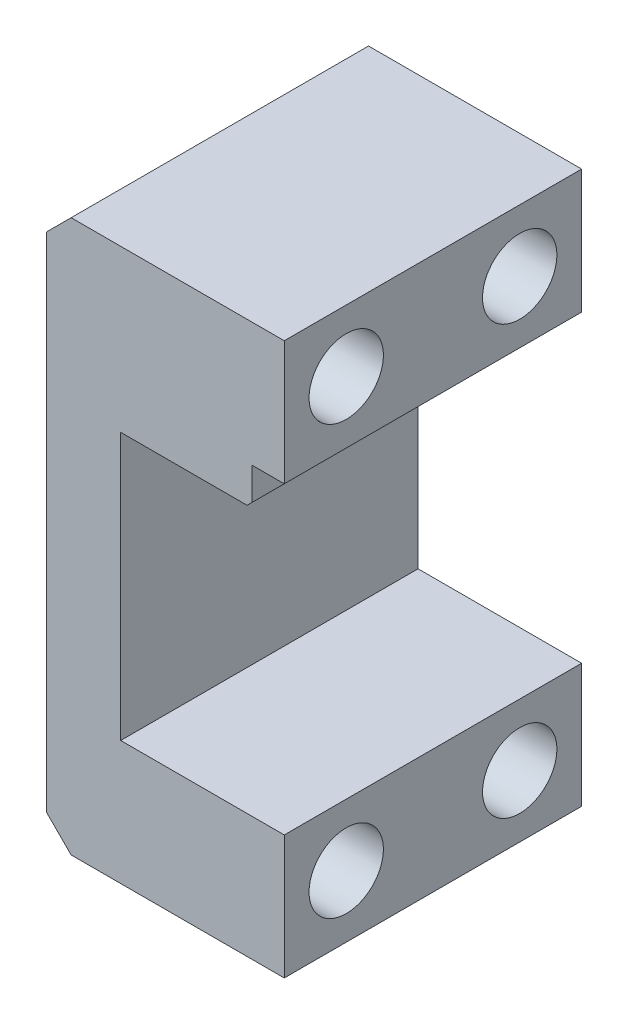
ISO-10303-21;
HEADER;
FILE_DESCRIPTION(('STEP AP214'),'2;1');
FILE_NAME('part.step','',(''),(''),'','','');
FILE_SCHEMA(('AUTOMOTIVE_DESIGN { 1 0 10303 214 1 1 1 1 }'));
ENDSEC;
DATA;
#1=APPLICATION_CONTEXT('core data for automotive mechanical design processes');
#2=APPLICATION_PROTOCOL_DEFINITION('international standard','automotive_design',2000,#1);
#3=PRODUCT_CONTEXT('',#1,'mechanical');
#4=PRODUCT('Part','Part','',(#3));
#5=PRODUCT_RELATED_PRODUCT_CATEGORY('part','',(#4));
#6=PRODUCT_DEFINITION_FORMATION('','',#4);
#7=PRODUCT_DEFINITION_CONTEXT('part definition',#1,'design');
#8=PRODUCT_DEFINITION('design','',#6,#7);
#9=PRODUCT_DEFINITION_SHAPE('','',#8);
#10=(LENGTH_UNIT() NAMED_UNIT(*) SI_UNIT(.MILLI.,.METRE.));
#11=(NAMED_UNIT(*) PLANE_ANGLE_UNIT() SI_UNIT($,.RADIAN.));
#12=(NAMED_UNIT(*) SI_UNIT($,.STERADIAN.) SOLID_ANGLE_UNIT());
#13=UNCERTAINTY_MEASURE_WITH_UNIT(LENGTH_MEASURE(1.E-05),#10,'distance_accuracy_value','');
#14=(GEOMETRIC_REPRESENTATION_CONTEXT(3) GLOBAL_UNCERTAINTY_ASSIGNED_CONTEXT((#13)) GLOBAL_UNIT_ASSIGNED_CONTEXT((#10,
#11,#12)) REPRESENTATION_CONTEXT('',''));
#15=CARTESIAN_POINT('',(0.,0.,0.));
#16=DIRECTION('',(0.,0.,1.));
#17=DIRECTION('',(1.,0.,0.));
#18=AXIS2_PLACEMENT_3D('',#15,#16,#17);
#19=CARTESIAN_POINT('',(9.6,0.,12.));
#20=DIRECTION('',(0.,1.,0.));
#21=DIRECTION('',(-1.,0.,0.));
#22=AXIS2_PLACEMENT_3D('',#19,#20,#21);
#23=PLANE('',#22);
#24=DIRECTION('',(1.,0.,0.));
#25=VECTOR('',#24,1.);
#26=CARTESIAN_POINT('',(9.6,0.,12.));
#27=LINE('',#26,#25);
#28=CARTESIAN_POINT('',(1.,0.,12.));
#29=VERTEX_POINT('',#28);
#30=CARTESIAN_POINT('',(9.6,0.,12.));
#31=VERTEX_POINT('',#30);
#32=EDGE_CURVE('E142',#29,#31,#27,.T.);
#33=ORIENTED_EDGE('',*,*,#32,.F.);
#34=DIRECTION('',(0.,0.,-1.));
#35=VECTOR('',#34,1.);
#36=CARTESIAN_POINT('',(1.,0.,12.));
#37=LINE('',#36,#35);
#38=CARTESIAN_POINT('',(1.,0.,0.));
#39=VERTEX_POINT('',#38);
#40=EDGE_CURVE('E180',#29,#39,#37,.T.);
#41=ORIENTED_EDGE('',*,*,#40,.T.);
#42=DIRECTION('',(1.,0.,0.));
#43=VECTOR('',#42,1.);
#44=CARTESIAN_POINT('',(9.6,0.,0.));
#45=LINE('',#44,#43);
#46=CARTESIAN_POINT('',(9.6,0.,0.));
#47=VERTEX_POINT('',#46);
#48=EDGE_CURVE('E164',#39,#47,#45,.T.);
#49=ORIENTED_EDGE('',*,*,#48,.T.);
#50=DIRECTION('',(0.,0.,-1.));
#51=VECTOR('',#50,1.);
#52=CARTESIAN_POINT('',(9.6,0.,12.));
#53=LINE('',#52,#51);
#54=EDGE_CURVE('E157',#31,#47,#53,.T.);
#55=ORIENTED_EDGE('',*,*,#54,.F.);
#56=EDGE_LOOP('',(#33,#41,#49,#55));
#57=FACE_BOUND('',#56,.T.);
#58=ADVANCED_FACE('F34',(#57),#23,.F.);
#59=CARTESIAN_POINT('',(9.6,5.,12.));
#60=DIRECTION('',(-1.,0.,0.));
#61=DIRECTION('',(0.,0.,1.));
#62=AXIS2_PLACEMENT_3D('',#59,#60,#61);
#63=PLANE('',#62);
#64=CARTESIAN_POINT('',(9.6,2.5,2.50000000000001));
#65=DIRECTION('',(-1.,0.,0.));
#66=DIRECTION('',(0.,0.,1.));
#67=AXIS2_PLACEMENT_3D('',#64,#65,#66);
#68=CIRCLE('',#67,1.5);
#69=CARTESIAN_POINT('',(9.6,2.5,4.00000000000001));
#70=VERTEX_POINT('',#69);
#71=EDGE_CURVE('E351',#70,#70,#68,.T.);
#72=ORIENTED_EDGE('',*,*,#71,.T.);
#73=EDGE_LOOP('',(#72));
#74=FACE_BOUND('',#73,.T.);
#75=CARTESIAN_POINT('',(9.6,2.5,9.5));
#76=DIRECTION('',(-1.,0.,0.));
#77=DIRECTION('',(0.,0.,1.));
#78=AXIS2_PLACEMENT_3D('',#75,#76,#77);
#79=CIRCLE('',#78,1.5);
#80=CARTESIAN_POINT('',(9.6,2.5,11.));
#81=VERTEX_POINT('',#80);
#82=EDGE_CURVE('E346',#81,#81,#79,.T.);
#83=ORIENTED_EDGE('',*,*,#82,.T.);
#84=EDGE_LOOP('',(#83));
#85=FACE_BOUND('',#84,.T.);
#86=DIRECTION('',(0.,1.,0.));
#87=VECTOR('',#86,1.);
#88=CARTESIAN_POINT('',(9.6,5.,0.));
#89=LINE('',#88,#87);
#90=CARTESIAN_POINT('',(9.6,5.,0.));
#91=VERTEX_POINT('',#90);
#92=EDGE_CURVE('E241',#47,#91,#89,.T.);
#93=ORIENTED_EDGE('',*,*,#92,.T.);
#94=DIRECTION('',(0.,0.,-1.));
#95=VECTOR('',#94,1.);
#96=CARTESIAN_POINT('',(9.6,5.,12.));
#97=LINE('',#96,#95);
#98=CARTESIAN_POINT('',(9.6,5.,12.));
#99=VERTEX_POINT('',#98);
#100=EDGE_CURVE('E159',#99,#91,#97,.T.);
#101=ORIENTED_EDGE('',*,*,#100,.F.);
#102=DIRECTION('',(0.,1.,0.));
#103=VECTOR('',#102,1.);
#104=CARTESIAN_POINT('',(9.6,5.,12.));
#105=LINE('',#104,#103);
#106=EDGE_CURVE('E145',#31,#99,#105,.T.);
#107=ORIENTED_EDGE('',*,*,#106,.F.);
#108=ORIENTED_EDGE('',*,*,#54,.T.);
#109=EDGE_LOOP('',(#93,#101,#107,#108));
#110=FACE_BOUND('',#109,.T.);
#111=ADVANCED_FACE('F156',(#74,#85,#110),#63,.F.);
#112=CARTESIAN_POINT('',(3.,5.,12.));
#113=DIRECTION('',(0.,-1.,0.));
#114=DIRECTION('',(1.,0.,0.));
#115=AXIS2_PLACEMENT_3D('',#112,#113,#114);
#116=PLANE('',#115);
#117=DIRECTION('',(-1.,0.,0.));
#118=VECTOR('',#117,1.);
#119=CARTESIAN_POINT('',(3.,5.,0.));
#120=LINE('',#119,#118);
#121=CARTESIAN_POINT('',(3.,5.,0.));
#122=VERTEX_POINT('',#121);
#123=EDGE_CURVE('E243',#91,#122,#120,.T.);
#124=ORIENTED_EDGE('',*,*,#123,.T.);
#125=DIRECTION('',(0.,0.,-1.));
#126=VECTOR('',#125,1.);
#127=CARTESIAN_POINT('',(3.,5.,12.));
#128=LINE('',#127,#126);
#129=CARTESIAN_POINT('',(3.,5.,12.));
#130=VERTEX_POINT('',#129);
#131=EDGE_CURVE('E171',#130,#122,#128,.T.);
#132=ORIENTED_EDGE('',*,*,#131,.F.);
#133=DIRECTION('',(-1.,0.,0.));
#134=VECTOR('',#133,1.);
#135=CARTESIAN_POINT('',(3.,5.,12.));
#136=LINE('',#135,#134);
#137=EDGE_CURVE('E161',#99,#130,#136,.T.);
#138=ORIENTED_EDGE('',*,*,#137,.F.);
#139=ORIENTED_EDGE('',*,*,#100,.T.);
#140=EDGE_LOOP('',(#124,#132,#138,#139));
#141=FACE_BOUND('',#140,.T.);
#142=ADVANCED_FACE('F320',(#141),#116,.F.);
#143=CARTESIAN_POINT('',(3.,15.77,12.));
#144=DIRECTION('',(-1.,0.,0.));
#145=DIRECTION('',(0.,-1.,0.));
#146=AXIS2_PLACEMENT_3D('',#143,#144,#145);
#147=PLANE('',#146);
#148=DIRECTION('',(0.,1.,0.));
#149=VECTOR('',#148,1.);
#150=CARTESIAN_POINT('',(3.,15.77,0.));
#151=LINE('',#150,#149);
#152=CARTESIAN_POINT('',(3.,15.77,0.));
#153=VERTEX_POINT('',#152);
#154=EDGE_CURVE('E245',#122,#153,#151,.T.);
#155=ORIENTED_EDGE('',*,*,#154,.T.);
#156=DIRECTION('',(0.,0.,-1.));
#157=VECTOR('',#156,1.);
#158=CARTESIAN_POINT('',(3.,15.77,12.));
#159=LINE('',#158,#157);
#160=CARTESIAN_POINT('',(3.,15.77,12.));
#161=VERTEX_POINT('',#160);
#162=EDGE_CURVE('E267',#161,#153,#159,.T.);
#163=ORIENTED_EDGE('',*,*,#162,.F.);
#164=DIRECTION('',(0.,1.,0.));
#165=VECTOR('',#164,1.);
#166=CARTESIAN_POINT('',(3.,15.77,12.));
#167=LINE('',#166,#165);
#168=EDGE_CURVE('E228',#130,#161,#167,.T.);
#169=ORIENTED_EDGE('',*,*,#168,.F.);
#170=ORIENTED_EDGE('',*,*,#131,.T.);
#171=EDGE_LOOP('',(#155,#163,#169,#170));
#172=FACE_BOUND('',#171,.T.);
#173=ADVANCED_FACE('F274',(#172),#147,.F.);
#174=CARTESIAN_POINT('',(8.3,15.77,12.));
#175=DIRECTION('',(0.,1.,0.));
#176=DIRECTION('',(0.,0.,1.));
#177=AXIS2_PLACEMENT_3D('',#174,#175,#176);
#178=PLANE('',#177);
#179=DIRECTION('',(1.,0.,0.));
#180=VECTOR('',#179,1.);
#181=CARTESIAN_POINT('',(8.3,15.77,0.));
#182=LINE('',#181,#180);
#183=CARTESIAN_POINT('',(8.1,15.77,0.));
#184=VERTEX_POINT('',#183);
#185=EDGE_CURVE('E247',#153,#184,#182,.T.);
#186=ORIENTED_EDGE('',*,*,#185,.T.);
#187=DIRECTION('',(0.,0.,1.));
#188=VECTOR('',#187,1.);
#189=CARTESIAN_POINT('',(8.1,15.77,12.));
#190=LINE('',#189,#188);
#191=CARTESIAN_POINT('',(8.1,15.77,12.));
#192=VERTEX_POINT('',#191);
#193=EDGE_CURVE('E176',#184,#192,#190,.T.);
#194=ORIENTED_EDGE('',*,*,#193,.T.);
#195=DIRECTION('',(1.,0.,0.));
#196=VECTOR('',#195,1.);
#197=CARTESIAN_POINT('',(8.3,15.77,12.));
#198=LINE('',#197,#196);
#199=EDGE_CURVE('E230',#161,#192,#198,.T.);
#200=ORIENTED_EDGE('',*,*,#199,.F.);
#201=ORIENTED_EDGE('',*,*,#162,.T.);
#202=EDGE_LOOP('',(#186,#194,#200,#201));
#203=FACE_BOUND('',#202,.T.);
#204=ADVANCED_FACE('F284',(#203),#178,.F.);
#205=CARTESIAN_POINT('',(8.3,17.27,12.));
#206=DIRECTION('',(-1.,0.,0.));
#207=DIRECTION('',(0.,-1.,0.));
#208=AXIS2_PLACEMENT_3D('',#205,#206,#207);
#209=PLANE('',#208);
#210=DIRECTION('',(0.,1.,0.));
#211=VECTOR('',#210,1.);
#212=CARTESIAN_POINT('',(8.3,17.27,12.));
#213=LINE('',#212,#211);
#214=CARTESIAN_POINT('',(8.3,15.97,12.));
#215=VERTEX_POINT('',#214);
#216=CARTESIAN_POINT('',(8.3,17.27,12.));
#217=VERTEX_POINT('',#216);
#218=EDGE_CURVE('E233',#215,#217,#213,.T.);
#219=ORIENTED_EDGE('',*,*,#218,.F.);
#220=DIRECTION('',(0.,0.,-1.));
#221=VECTOR('',#220,1.);
#222=CARTESIAN_POINT('',(8.3,15.97,12.));
#223=LINE('',#222,#221);
#224=CARTESIAN_POINT('',(8.3,15.97,0.));
#225=VERTEX_POINT('',#224);
#226=EDGE_CURVE('E166',#215,#225,#223,.T.);
#227=ORIENTED_EDGE('',*,*,#226,.T.);
#228=DIRECTION('',(0.,1.,0.));
#229=VECTOR('',#228,1.);
#230=CARTESIAN_POINT('',(8.3,17.27,0.));
#231=LINE('',#230,#229);
#232=CARTESIAN_POINT('',(8.3,17.27,0.));
#233=VERTEX_POINT('',#232);
#234=EDGE_CURVE('E250',#225,#233,#231,.T.);
#235=ORIENTED_EDGE('',*,*,#234,.T.);
#236=DIRECTION('',(0.,0.,-1.));
#237=VECTOR('',#236,1.);
#238=CARTESIAN_POINT('',(8.3,17.27,12.));
#239=LINE('',#238,#237);
#240=EDGE_CURVE('E264',#217,#233,#239,.T.);
#241=ORIENTED_EDGE('',*,*,#240,.F.);
#242=EDGE_LOOP('',(#219,#227,#235,#241));
#243=FACE_BOUND('',#242,.T.);
#244=ADVANCED_FACE('F293',(#243),#209,.F.);
#245=CARTESIAN_POINT('',(9.6,17.27,12.));
#246=DIRECTION('',(0.,1.,0.));
#247=DIRECTION('',(0.,0.,1.));
#248=AXIS2_PLACEMENT_3D('',#245,#246,#247);
#249=PLANE('',#248);
#250=DIRECTION('',(1.,0.,0.));
#251=VECTOR('',#250,1.);
#252=CARTESIAN_POINT('',(9.6,17.27,0.));
#253=LINE('',#252,#251);
#254=CARTESIAN_POINT('',(9.6,17.27,0.));
#255=VERTEX_POINT('',#254);
#256=EDGE_CURVE('E252',#233,#255,#253,.T.);
#257=ORIENTED_EDGE('',*,*,#256,.T.);
#258=DIRECTION('',(0.,0.,-1.));
#259=VECTOR('',#258,1.);
#260=CARTESIAN_POINT('',(9.6,17.27,12.));
#261=LINE('',#260,#259);
#262=CARTESIAN_POINT('',(9.6,17.27,12.));
#263=VERTEX_POINT('',#262);
#264=EDGE_CURVE('E261',#263,#255,#261,.T.);
#265=ORIENTED_EDGE('',*,*,#264,.F.);
#266=DIRECTION('',(1.,0.,0.));
#267=VECTOR('',#266,1.);
#268=CARTESIAN_POINT('',(9.6,17.27,12.));
#269=LINE('',#268,#267);
#270=EDGE_CURVE('E235',#217,#263,#269,.T.);
#271=ORIENTED_EDGE('',*,*,#270,.F.);
#272=ORIENTED_EDGE('',*,*,#240,.T.);
#273=EDGE_LOOP('',(#257,#265,#271,#272));
#274=FACE_BOUND('',#273,.T.);
#275=ADVANCED_FACE('F298',(#274),#249,.F.);
#276=CARTESIAN_POINT('',(9.6,22.27,12.));
#277=DIRECTION('',(-1.,0.,0.));
#278=DIRECTION('',(0.,-1.,0.));
#279=AXIS2_PLACEMENT_3D('',#276,#277,#278);
#280=PLANE('',#279);
#281=CARTESIAN_POINT('',(9.6,19.77,9.5));
#282=DIRECTION('',(-1.,0.,0.));
#283=DIRECTION('',(0.,0.,1.));
#284=AXIS2_PLACEMENT_3D('',#281,#282,#283);
#285=CIRCLE('',#284,1.5);
#286=CARTESIAN_POINT('',(9.6,19.77,11.));
#287=VERTEX_POINT('',#286);
#288=EDGE_CURVE('E219',#287,#287,#285,.T.);
#289=ORIENTED_EDGE('',*,*,#288,.T.);
#290=EDGE_LOOP('',(#289));
#291=FACE_BOUND('',#290,.T.);
#292=CARTESIAN_POINT('',(9.6,19.77,2.5));
#293=DIRECTION('',(-1.,0.,0.));
#294=DIRECTION('',(0.,0.,1.));
#295=AXIS2_PLACEMENT_3D('',#292,#293,#294);
#296=CIRCLE('',#295,1.5);
#297=CARTESIAN_POINT('',(9.6,19.77,4.));
#298=VERTEX_POINT('',#297);
#299=EDGE_CURVE('E218',#298,#298,#296,.T.);
#300=ORIENTED_EDGE('',*,*,#299,.T.);
#301=EDGE_LOOP('',(#300));
#302=FACE_BOUND('',#301,.T.);
#303=DIRECTION('',(0.,1.,0.));
#304=VECTOR('',#303,1.);
#305=CARTESIAN_POINT('',(9.6,22.27,0.));
#306=LINE('',#305,#304);
#307=CARTESIAN_POINT('',(9.6,22.27,0.));
#308=VERTEX_POINT('',#307);
#309=EDGE_CURVE('E254',#255,#308,#306,.T.);
#310=ORIENTED_EDGE('',*,*,#309,.T.);
#311=DIRECTION('',(0.,0.,-1.));
#312=VECTOR('',#311,1.);
#313=CARTESIAN_POINT('',(9.6,22.27,12.));
#314=LINE('',#313,#312);
#315=CARTESIAN_POINT('',(9.6,22.27,12.));
#316=VERTEX_POINT('',#315);
#317=EDGE_CURVE('E208',#316,#308,#314,.T.);
#318=ORIENTED_EDGE('',*,*,#317,.F.);
#319=DIRECTION('',(0.,1.,0.));
#320=VECTOR('',#319,1.);
#321=CARTESIAN_POINT('',(9.6,22.27,12.));
#322=LINE('',#321,#320);
#323=EDGE_CURVE('E237',#263,#316,#322,.T.);
#324=ORIENTED_EDGE('',*,*,#323,.F.);
#325=ORIENTED_EDGE('',*,*,#264,.T.);
#326=EDGE_LOOP('',(#310,#318,#324,#325));
#327=FACE_BOUND('',#326,.T.);
#328=ADVANCED_FACE('F302',(#291,#302,#327),#280,.F.);
#329=CARTESIAN_POINT('',(0.,22.27,12.));
#330=DIRECTION('',(0.,-1.,0.));
#331=DIRECTION('',(0.,0.,-1.));
#332=AXIS2_PLACEMENT_3D('',#329,#330,#331);
#333=PLANE('',#332);
#334=DIRECTION('',(-1.,0.,0.));
#335=VECTOR('',#334,1.);
#336=CARTESIAN_POINT('',(0.,22.27,0.));
#337=LINE('',#336,#335);
#338=CARTESIAN_POINT('',(1.,22.27,0.));
#339=VERTEX_POINT('',#338);
#340=EDGE_CURVE('E256',#308,#339,#337,.T.);
#341=ORIENTED_EDGE('',*,*,#340,.T.);
#342=DIRECTION('',(0.,0.,1.));
#343=VECTOR('',#342,1.);
#344=CARTESIAN_POINT('',(1.,22.27,12.));
#345=LINE('',#344,#343);
#346=CARTESIAN_POINT('',(1.,22.27,12.));
#347=VERTEX_POINT('',#346);
#348=EDGE_CURVE('E11',#339,#347,#345,.T.);
#349=ORIENTED_EDGE('',*,*,#348,.T.);
#350=DIRECTION('',(-1.,0.,0.));
#351=VECTOR('',#350,1.);
#352=CARTESIAN_POINT('',(0.,22.27,12.));
#353=LINE('',#352,#351);
#354=EDGE_CURVE('E201',#316,#347,#353,.T.);
#355=ORIENTED_EDGE('',*,*,#354,.F.);
#356=ORIENTED_EDGE('',*,*,#317,.T.);
#357=EDGE_LOOP('',(#341,#349,#355,#356));
#358=FACE_BOUND('',#357,.T.);
#359=ADVANCED_FACE('F305',(#358),#333,.F.);
#360=CARTESIAN_POINT('',(0.,0.,12.));
#361=DIRECTION('',(1.,0.,0.));
#362=DIRECTION('',(0.,0.,-1.));
#363=AXIS2_PLACEMENT_3D('',#360,#361,#362);
#364=PLANE('',#363);
#365=DIRECTION('',(0.,-1.,0.));
#366=VECTOR('',#365,1.);
#367=CARTESIAN_POINT('',(0.,0.,0.));
#368=LINE('',#367,#366);
#369=CARTESIAN_POINT('',(0.,21.27,0.));
#370=VERTEX_POINT('',#369);
#371=CARTESIAN_POINT('',(0.,1.,0.));
#372=VERTEX_POINT('',#371);
#373=EDGE_CURVE('E152',#370,#372,#368,.T.);
#374=ORIENTED_EDGE('',*,*,#373,.T.);
#375=DIRECTION('',(0.,0.,1.));
#376=VECTOR('',#375,1.);
#377=CARTESIAN_POINT('',(0.,1.,12.));
#378=LINE('',#377,#376);
#379=CARTESIAN_POINT('',(0.,1.,2.50000000000001));
#380=VERTEX_POINT('',#379);
#381=EDGE_CURVE('E196',#372,#380,#378,.T.);
#382=ORIENTED_EDGE('',*,*,#381,.T.);
#383=CARTESIAN_POINT('',(0.,2.5,2.50000000000001));
#384=DIRECTION('',(-1.,0.,0.));
#385=DIRECTION('',(0.,0.,1.));
#386=AXIS2_PLACEMENT_3D('',#383,#384,#385);
#387=CIRCLE('',#386,1.5);
#388=EDGE_CURVE('E343',#380,#380,#387,.T.);
#389=ORIENTED_EDGE('',*,*,#388,.F.);
#390=DIRECTION('',(0.,0.,1.));
#391=VECTOR('',#390,1.);
#392=CARTESIAN_POINT('',(0.,1.,12.));
#393=LINE('',#392,#391);
#394=CARTESIAN_POINT('',(0.,1.,9.5));
#395=VERTEX_POINT('',#394);
#396=EDGE_CURVE('E194',#380,#395,#393,.T.);
#397=ORIENTED_EDGE('',*,*,#396,.T.);
#398=CARTESIAN_POINT('',(0.,2.5,9.5));
#399=DIRECTION('',(-1.,0.,0.));
#400=DIRECTION('',(0.,0.,1.));
#401=AXIS2_PLACEMENT_3D('',#398,#399,#400);
#402=CIRCLE('',#401,1.5);
#403=EDGE_CURVE('E341',#395,#395,#402,.T.);
#404=ORIENTED_EDGE('',*,*,#403,.F.);
#405=DIRECTION('',(0.,0.,1.));
#406=VECTOR('',#405,1.);
#407=CARTESIAN_POINT('',(0.,1.,12.));
#408=LINE('',#407,#406);
#409=CARTESIAN_POINT('',(0.,1.,12.));
#410=VERTEX_POINT('',#409);
#411=EDGE_CURVE('E55',#395,#410,#408,.T.);
#412=ORIENTED_EDGE('',*,*,#411,.T.);
#413=DIRECTION('',(0.,-1.,0.));
#414=VECTOR('',#413,1.);
#415=CARTESIAN_POINT('',(0.,0.,12.));
#416=LINE('',#415,#414);
#417=CARTESIAN_POINT('',(0.,21.27,12.));
#418=VERTEX_POINT('',#417);
#419=EDGE_CURVE('E200',#418,#410,#416,.T.);
#420=ORIENTED_EDGE('',*,*,#419,.F.);
#421=DIRECTION('',(0.,0.,-1.));
#422=VECTOR('',#421,1.);
#423=CARTESIAN_POINT('',(0.,21.27,12.));
#424=LINE('',#423,#422);
#425=CARTESIAN_POINT('',(0.,21.27,9.5));
#426=VERTEX_POINT('',#425);
#427=EDGE_CURVE('E190',#418,#426,#424,.T.);
#428=ORIENTED_EDGE('',*,*,#427,.T.);
#429=CARTESIAN_POINT('',(0.,19.77,9.5));
#430=DIRECTION('',(-1.,0.,0.));
#431=DIRECTION('',(0.,0.,1.));
#432=AXIS2_PLACEMENT_3D('',#429,#430,#431);
#433=CIRCLE('',#432,1.5);
#434=EDGE_CURVE('E215',#426,#426,#433,.T.);
#435=ORIENTED_EDGE('',*,*,#434,.F.);
#436=DIRECTION('',(0.,0.,-1.));
#437=VECTOR('',#436,1.);
#438=CARTESIAN_POINT('',(0.,21.27,12.));
#439=LINE('',#438,#437);
#440=CARTESIAN_POINT('',(0.,21.27,2.5));
#441=VERTEX_POINT('',#440);
#442=EDGE_CURVE('E188',#426,#441,#439,.T.);
#443=ORIENTED_EDGE('',*,*,#442,.T.);
#444=CARTESIAN_POINT('',(0.,19.77,2.5));
#445=DIRECTION('',(-1.,0.,0.));
#446=DIRECTION('',(0.,0.,1.));
#447=AXIS2_PLACEMENT_3D('',#444,#445,#446);
#448=CIRCLE('',#447,1.5);
#449=EDGE_CURVE('E214',#441,#441,#448,.T.);
#450=ORIENTED_EDGE('',*,*,#449,.F.);
#451=DIRECTION('',(0.,0.,-1.));
#452=VECTOR('',#451,1.);
#453=CARTESIAN_POINT('',(0.,21.27,12.));
#454=LINE('',#453,#452);
#455=EDGE_CURVE('E186',#441,#370,#454,.T.);
#456=ORIENTED_EDGE('',*,*,#455,.T.);
#457=EDGE_LOOP('',(#374,#382,#389,#397,#404,#412,#420,#428,#435,#443,#450,#456));
#458=FACE_BOUND('',#457,.T.);
#459=ADVANCED_FACE('F205',(#458),#364,.F.);
#460=CARTESIAN_POINT('',(0.,0.,12.));
#461=DIRECTION('',(0.,0.,-1.));
#462=DIRECTION('',(-1.,0.,0.));
#463=AXIS2_PLACEMENT_3D('',#460,#461,#462);
#464=PLANE('',#463);
#465=ORIENTED_EDGE('',*,*,#419,.T.);
#466=DIRECTION('',(-0.707106781186546,0.707106781186549,0.));
#467=VECTOR('',#466,1.);
#468=CARTESIAN_POINT('',(1.,0.,12.));
#469=LINE('',#468,#467);
#470=EDGE_CURVE('E42',#410,#29,#469,.F.);
#471=ORIENTED_EDGE('',*,*,#470,.T.);
#472=ORIENTED_EDGE('',*,*,#32,.T.);
#473=ORIENTED_EDGE('',*,*,#106,.T.);
#474=ORIENTED_EDGE('',*,*,#137,.T.);
#475=ORIENTED_EDGE('',*,*,#168,.T.);
#476=ORIENTED_EDGE('',*,*,#199,.T.);
#477=DIRECTION('',(-0.707106781186548,-0.707106781186548,0.));
#478=VECTOR('',#477,1.);
#479=CARTESIAN_POINT('',(8.3,15.97,12.));
#480=LINE('',#479,#478);
#481=EDGE_CURVE('E178',#192,#215,#480,.F.);
#482=ORIENTED_EDGE('',*,*,#481,.T.);
#483=ORIENTED_EDGE('',*,*,#218,.T.);
#484=ORIENTED_EDGE('',*,*,#270,.T.);
#485=ORIENTED_EDGE('',*,*,#323,.T.);
#486=ORIENTED_EDGE('',*,*,#354,.T.);
#487=DIRECTION('',(0.707106781186549,0.707106781186546,0.));
#488=VECTOR('',#487,1.);
#489=CARTESIAN_POINT('',(0.,21.27,12.));
#490=LINE('',#489,#488);
#491=EDGE_CURVE('E198',#347,#418,#490,.F.);
#492=ORIENTED_EDGE('',*,*,#491,.T.);
#493=EDGE_LOOP('',(#465,#471,#472,#473,#474,#475,#476,#482,#483,#484,#485,#486,#492));
#494=FACE_BOUND('',#493,.T.);
#495=ADVANCED_FACE('F144',(#494),#464,.F.);
#496=CARTESIAN_POINT('',(0.,0.,0.));
#497=DIRECTION('',(0.,0.,-1.));
#498=DIRECTION('',(-1.,0.,0.));
#499=AXIS2_PLACEMENT_3D('',#496,#497,#498);
#500=PLANE('',#499);
#501=ORIENTED_EDGE('',*,*,#48,.F.);
#502=DIRECTION('',(0.707106781186546,-0.707106781186549,0.));
#503=VECTOR('',#502,1.);
#504=CARTESIAN_POINT('',(0.500000000000002,0.500000000000001,0.));
#505=LINE('',#504,#503);
#506=EDGE_CURVE('E184',#39,#372,#505,.F.);
#507=ORIENTED_EDGE('',*,*,#506,.T.);
#508=ORIENTED_EDGE('',*,*,#373,.F.);
#509=DIRECTION('',(-0.707106781186549,-0.707106781186546,0.));
#510=VECTOR('',#509,1.);
#511=CARTESIAN_POINT('',(-10.635,10.635,0.));
#512=LINE('',#511,#510);
#513=EDGE_CURVE('E182',#370,#339,#512,.F.);
#514=ORIENTED_EDGE('',*,*,#513,.T.);
#515=ORIENTED_EDGE('',*,*,#340,.F.);
#516=ORIENTED_EDGE('',*,*,#309,.F.);
#517=ORIENTED_EDGE('',*,*,#256,.F.);
#518=ORIENTED_EDGE('',*,*,#234,.F.);
#519=DIRECTION('',(0.707106781186548,0.707106781186548,0.));
#520=VECTOR('',#519,1.);
#521=CARTESIAN_POINT('',(-3.835,3.835,0.));
#522=LINE('',#521,#520);
#523=EDGE_CURVE('E169',#225,#184,#522,.F.);
#524=ORIENTED_EDGE('',*,*,#523,.T.);
#525=ORIENTED_EDGE('',*,*,#185,.F.);
#526=ORIENTED_EDGE('',*,*,#154,.F.);
#527=ORIENTED_EDGE('',*,*,#123,.F.);
#528=ORIENTED_EDGE('',*,*,#92,.F.);
#529=EDGE_LOOP('',(#501,#507,#508,#514,#515,#516,#517,#518,#524,#525,#526,#527,#528));
#530=FACE_BOUND('',#529,.T.);
#531=ADVANCED_FACE('F280',(#530),#500,.T.);
#532=CARTESIAN_POINT('',(8.3,15.97,12.));
#533=DIRECTION('',(-0.707106781186548,0.707106781186548,0.));
#534=DIRECTION('',(0.,0.,-1.));
#535=AXIS2_PLACEMENT_3D('',#532,#533,#534);
#536=PLANE('',#535);
#537=ORIENTED_EDGE('',*,*,#481,.F.);
#538=ORIENTED_EDGE('',*,*,#193,.F.);
#539=ORIENTED_EDGE('',*,*,#523,.F.);
#540=ORIENTED_EDGE('',*,*,#226,.F.);
#541=EDGE_LOOP('',(#537,#538,#539,#540));
#542=FACE_BOUND('',#541,.T.);
#543=ADVANCED_FACE('F288',(#542),#536,.F.);
#544=CARTESIAN_POINT('',(9.6,19.77,2.5));
#545=DIRECTION('',(-1.,0.,0.));
#546=DIRECTION('',(0.,0.,1.));
#547=AXIS2_PLACEMENT_3D('',#544,#545,#546);
#548=CYLINDRICAL_SURFACE('',#547,1.5);
#549=ORIENTED_EDGE('',*,*,#299,.F.);
#550=EDGE_LOOP('',(#549));
#551=FACE_BOUND('',#550,.T.);
#552=ORIENTED_EDGE('',*,*,#449,.T.);
#553=EDGE_LOOP('',(#552));
#554=FACE_BOUND('',#553,.T.);
#555=ADVANCED_FACE('F217',(#551,#554),#548,.F.);
#556=CARTESIAN_POINT('',(9.6,2.5,9.5));
#557=DIRECTION('',(-1.,0.,0.));
#558=DIRECTION('',(0.,0.,1.));
#559=AXIS2_PLACEMENT_3D('',#556,#557,#558);
#560=CYLINDRICAL_SURFACE('',#559,1.5);
#561=ORIENTED_EDGE('',*,*,#82,.F.);
#562=EDGE_LOOP('',(#561));
#563=FACE_BOUND('',#562,.T.);
#564=ORIENTED_EDGE('',*,*,#403,.T.);
#565=EDGE_LOOP('',(#564));
#566=FACE_BOUND('',#565,.T.);
#567=ADVANCED_FACE('F345',(#563,#566),#560,.F.);
#568=CARTESIAN_POINT('',(9.6,2.5,2.50000000000001));
#569=DIRECTION('',(-1.,0.,0.));
#570=DIRECTION('',(0.,0.,1.));
#571=AXIS2_PLACEMENT_3D('',#568,#569,#570);
#572=CYLINDRICAL_SURFACE('',#571,1.5);
#573=ORIENTED_EDGE('',*,*,#71,.F.);
#574=EDGE_LOOP('',(#573));
#575=FACE_BOUND('',#574,.T.);
#576=ORIENTED_EDGE('',*,*,#388,.T.);
#577=EDGE_LOOP('',(#576));
#578=FACE_BOUND('',#577,.T.);
#579=ADVANCED_FACE('F334',(#575,#578),#572,.F.);
#580=CARTESIAN_POINT('',(9.6,19.77,9.5));
#581=DIRECTION('',(-1.,0.,0.));
#582=DIRECTION('',(0.,0.,1.));
#583=AXIS2_PLACEMENT_3D('',#580,#581,#582);
#584=CYLINDRICAL_SURFACE('',#583,1.5);
#585=ORIENTED_EDGE('',*,*,#288,.F.);
#586=EDGE_LOOP('',(#585));
#587=FACE_BOUND('',#586,.T.);
#588=ORIENTED_EDGE('',*,*,#434,.T.);
#589=EDGE_LOOP('',(#588));
#590=FACE_BOUND('',#589,.T.);
#591=ADVANCED_FACE('F328',(#587,#590),#584,.F.);
#592=CARTESIAN_POINT('',(1.,0.,12.));
#593=DIRECTION('',(0.707106781186549,0.707106781186546,0.));
#594=DIRECTION('',(0.,0.,-1.));
#595=AXIS2_PLACEMENT_3D('',#592,#593,#594);
#596=PLANE('',#595);
#597=ORIENTED_EDGE('',*,*,#396,.F.);
#598=ORIENTED_EDGE('',*,*,#381,.F.);
#599=ORIENTED_EDGE('',*,*,#506,.F.);
#600=ORIENTED_EDGE('',*,*,#40,.F.);
#601=ORIENTED_EDGE('',*,*,#470,.F.);
#602=ORIENTED_EDGE('',*,*,#411,.F.);
#603=EDGE_LOOP('',(#597,#598,#599,#600,#601,#602));
#604=FACE_BOUND('',#603,.T.);
#605=ADVANCED_FACE('F326',(#604),#596,.F.);
#606=CARTESIAN_POINT('',(0.,21.27,12.));
#607=DIRECTION('',(0.707106781186546,-0.707106781186549,0.));
#608=DIRECTION('',(0.,0.,-1.));
#609=AXIS2_PLACEMENT_3D('',#606,#607,#608);
#610=PLANE('',#609);
#611=ORIENTED_EDGE('',*,*,#491,.F.);
#612=ORIENTED_EDGE('',*,*,#348,.F.);
#613=ORIENTED_EDGE('',*,*,#513,.F.);
#614=ORIENTED_EDGE('',*,*,#455,.F.);
#615=ORIENTED_EDGE('',*,*,#442,.F.);
#616=ORIENTED_EDGE('',*,*,#427,.F.);
#617=EDGE_LOOP('',(#611,#612,#613,#614,#615,#616));
#618=FACE_BOUND('',#617,.T.);
#619=ADVANCED_FACE('F36',(#618),#610,.F.);
#620=CLOSED_SHELL('',(#58,#111,#142,#173,#204,#244,#275,#328,#359,#459,#495,#531,#543,#555,#567,
#579,#591,#605,#619));
#621=MANIFOLD_SOLID_BREP('B2',#620);
#622=ADVANCED_BREP_SHAPE_REPRESENTATION('',(#18,#621),#14);
#623=SHAPE_DEFINITION_REPRESENTATION(#9,#622);
ENDSEC;
END-ISO-10303-21;
